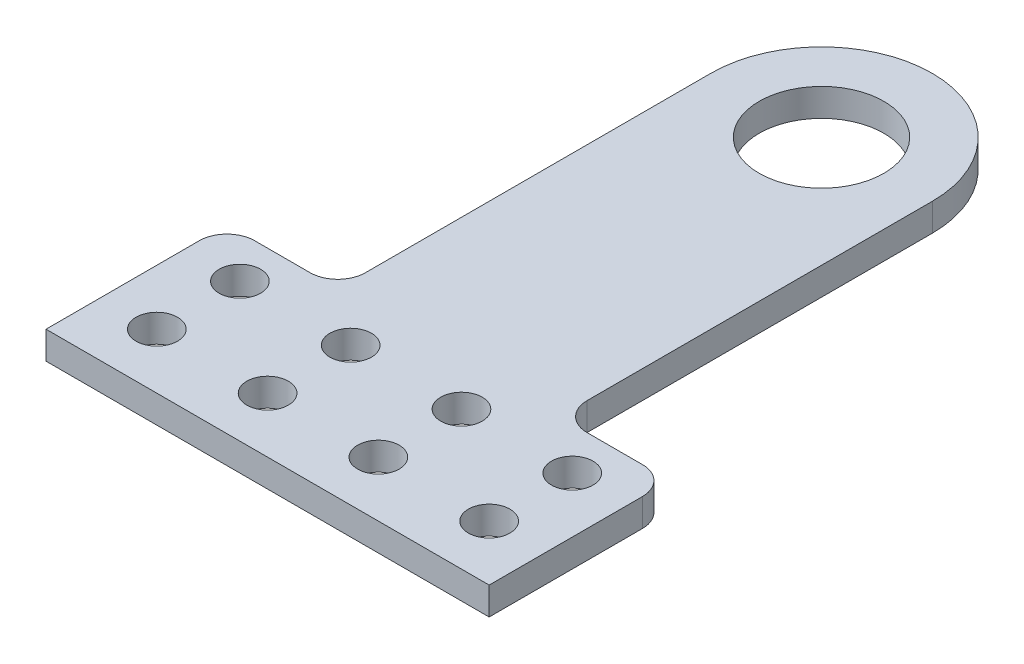
ISO-10303-21;
HEADER;
FILE_DESCRIPTION(('STEP AP214'),'2;1');
FILE_NAME('part.step','',(''),(''),'','','');
FILE_SCHEMA(('AUTOMOTIVE_DESIGN { 1 0 10303 214 1 1 1 1 }'));
ENDSEC;
DATA;
#1=APPLICATION_CONTEXT('core data for automotive mechanical design processes');
#2=APPLICATION_PROTOCOL_DEFINITION('international standard','automotive_design',2000,#1);
#3=PRODUCT_CONTEXT('',#1,'mechanical');
#4=PRODUCT('Part','Part','',(#3));
#5=PRODUCT_RELATED_PRODUCT_CATEGORY('part','',(#4));
#6=PRODUCT_DEFINITION_FORMATION('','',#4);
#7=PRODUCT_DEFINITION_CONTEXT('part definition',#1,'design');
#8=PRODUCT_DEFINITION('design','',#6,#7);
#9=PRODUCT_DEFINITION_SHAPE('','',#8);
#10=(LENGTH_UNIT() NAMED_UNIT(*) SI_UNIT(.MILLI.,.METRE.));
#11=(NAMED_UNIT(*) PLANE_ANGLE_UNIT() SI_UNIT($,.RADIAN.));
#12=(NAMED_UNIT(*) SI_UNIT($,.STERADIAN.) SOLID_ANGLE_UNIT());
#13=UNCERTAINTY_MEASURE_WITH_UNIT(LENGTH_MEASURE(1.E-05),#10,'distance_accuracy_value','');
#14=(GEOMETRIC_REPRESENTATION_CONTEXT(3) GLOBAL_UNCERTAINTY_ASSIGNED_CONTEXT((#13)) GLOBAL_UNIT_ASSIGNED_CONTEXT((#10,
#11,#12)) REPRESENTATION_CONTEXT('',''));
#15=CARTESIAN_POINT('',(0.,0.,0.));
#16=DIRECTION('',(0.,0.,1.));
#17=DIRECTION('',(1.,0.,0.));
#18=AXIS2_PLACEMENT_3D('',#15,#16,#17);
#19=CARTESIAN_POINT('',(38.1,0.,44.45));
#20=DIRECTION('',(0.,1.,0.));
#21=DIRECTION('',(0.,0.,1.));
#22=AXIS2_PLACEMENT_3D('',#19,#20,#21);
#23=CYLINDRICAL_SURFACE('',#22,4.7625);
#24=CARTESIAN_POINT('',(38.1,0.,44.45));
#25=DIRECTION('',(0.,1.,0.));
#26=DIRECTION('',(0.,0.,1.));
#27=AXIS2_PLACEMENT_3D('',#24,#25,#26);
#28=CIRCLE('',#27,4.7625);
#29=CARTESIAN_POINT('',(38.1,0.,49.2125));
#30=VERTEX_POINT('',#29);
#31=EDGE_CURVE('E219',#30,#30,#28,.T.);
#32=ORIENTED_EDGE('',*,*,#31,.F.);
#33=EDGE_LOOP('',(#32));
#34=FACE_BOUND('',#33,.T.);
#35=CARTESIAN_POINT('',(38.1,6.35,44.45));
#36=DIRECTION('',(0.,1.,0.));
#37=DIRECTION('',(0.,0.,1.));
#38=AXIS2_PLACEMENT_3D('',#35,#36,#37);
#39=CIRCLE('',#38,4.7625);
#40=CARTESIAN_POINT('',(38.1,6.35,49.2125));
#41=VERTEX_POINT('',#40);
#42=EDGE_CURVE('E222',#41,#41,#39,.T.);
#43=ORIENTED_EDGE('',*,*,#42,.T.);
#44=EDGE_LOOP('',(#43));
#45=FACE_BOUND('',#44,.T.);
#46=ADVANCED_FACE('F37',(#34,#45),#23,.F.);
#47=CARTESIAN_POINT('',(12.7,0.,44.45));
#48=DIRECTION('',(0.,1.,0.));
#49=DIRECTION('',(0.,0.,1.));
#50=AXIS2_PLACEMENT_3D('',#47,#48,#49);
#51=CYLINDRICAL_SURFACE('',#50,4.7625);
#52=CARTESIAN_POINT('',(12.7,0.,44.45));
#53=DIRECTION('',(0.,1.,0.));
#54=DIRECTION('',(0.,0.,1.));
#55=AXIS2_PLACEMENT_3D('',#52,#53,#54);
#56=CIRCLE('',#55,4.7625);
#57=CARTESIAN_POINT('',(12.7,0.,49.2125));
#58=VERTEX_POINT('',#57);
#59=EDGE_CURVE('E213',#58,#58,#56,.T.);
#60=ORIENTED_EDGE('',*,*,#59,.F.);
#61=EDGE_LOOP('',(#60));
#62=FACE_BOUND('',#61,.T.);
#63=CARTESIAN_POINT('',(12.7,6.35,44.45));
#64=DIRECTION('',(0.,1.,0.));
#65=DIRECTION('',(0.,0.,1.));
#66=AXIS2_PLACEMENT_3D('',#63,#64,#65);
#67=CIRCLE('',#66,4.7625);
#68=CARTESIAN_POINT('',(12.7,6.35,49.2125));
#69=VERTEX_POINT('',#68);
#70=EDGE_CURVE('E216',#69,#69,#67,.T.);
#71=ORIENTED_EDGE('',*,*,#70,.T.);
#72=EDGE_LOOP('',(#71));
#73=FACE_BOUND('',#72,.T.);
#74=ADVANCED_FACE('F327',(#62,#73),#51,.F.);
#75=CARTESIAN_POINT('',(-12.7,0.,44.45));
#76=DIRECTION('',(0.,1.,0.));
#77=DIRECTION('',(0.,0.,1.));
#78=AXIS2_PLACEMENT_3D('',#75,#76,#77);
#79=CYLINDRICAL_SURFACE('',#78,4.7625);
#80=CARTESIAN_POINT('',(-12.7,0.,44.45));
#81=DIRECTION('',(0.,1.,0.));
#82=DIRECTION('',(0.,0.,1.));
#83=AXIS2_PLACEMENT_3D('',#80,#81,#82);
#84=CIRCLE('',#83,4.7625);
#85=CARTESIAN_POINT('',(-12.7,0.,49.2125));
#86=VERTEX_POINT('',#85);
#87=EDGE_CURVE('E207',#86,#86,#84,.T.);
#88=ORIENTED_EDGE('',*,*,#87,.F.);
#89=EDGE_LOOP('',(#88));
#90=FACE_BOUND('',#89,.T.);
#91=CARTESIAN_POINT('',(-12.7,6.35,44.45));
#92=DIRECTION('',(0.,1.,0.));
#93=DIRECTION('',(0.,0.,1.));
#94=AXIS2_PLACEMENT_3D('',#91,#92,#93);
#95=CIRCLE('',#94,4.7625);
#96=CARTESIAN_POINT('',(-12.7,6.35,49.2125));
#97=VERTEX_POINT('',#96);
#98=EDGE_CURVE('E210',#97,#97,#95,.T.);
#99=ORIENTED_EDGE('',*,*,#98,.T.);
#100=EDGE_LOOP('',(#99));
#101=FACE_BOUND('',#100,.T.);
#102=ADVANCED_FACE('F333',(#90,#101),#79,.F.);
#103=CARTESIAN_POINT('',(-38.1,0.,44.45));
#104=DIRECTION('',(0.,1.,0.));
#105=DIRECTION('',(0.,0.,1.));
#106=AXIS2_PLACEMENT_3D('',#103,#104,#105);
#107=CYLINDRICAL_SURFACE('',#106,4.7625);
#108=CARTESIAN_POINT('',(-38.1,0.,44.45));
#109=DIRECTION('',(0.,1.,0.));
#110=DIRECTION('',(0.,0.,1.));
#111=AXIS2_PLACEMENT_3D('',#108,#109,#110);
#112=CIRCLE('',#111,4.7625);
#113=CARTESIAN_POINT('',(-38.1,0.,49.2125));
#114=VERTEX_POINT('',#113);
#115=EDGE_CURVE('E201',#114,#114,#112,.T.);
#116=ORIENTED_EDGE('',*,*,#115,.F.);
#117=EDGE_LOOP('',(#116));
#118=FACE_BOUND('',#117,.T.);
#119=CARTESIAN_POINT('',(-38.1,6.35,44.45));
#120=DIRECTION('',(0.,1.,0.));
#121=DIRECTION('',(0.,0.,1.));
#122=AXIS2_PLACEMENT_3D('',#119,#120,#121);
#123=CIRCLE('',#122,4.7625);
#124=CARTESIAN_POINT('',(-38.1,6.35,49.2125));
#125=VERTEX_POINT('',#124);
#126=EDGE_CURVE('E204',#125,#125,#123,.T.);
#127=ORIENTED_EDGE('',*,*,#126,.T.);
#128=EDGE_LOOP('',(#127));
#129=FACE_BOUND('',#128,.T.);
#130=ADVANCED_FACE('F398',(#118,#129),#107,.F.);
#131=CARTESIAN_POINT('',(38.1,0.,63.5));
#132=DIRECTION('',(0.,1.,0.));
#133=DIRECTION('',(0.,0.,1.));
#134=AXIS2_PLACEMENT_3D('',#131,#132,#133);
#135=CYLINDRICAL_SURFACE('',#134,4.7625);
#136=CARTESIAN_POINT('',(38.1,0.,63.5));
#137=DIRECTION('',(0.,1.,0.));
#138=DIRECTION('',(0.,0.,1.));
#139=AXIS2_PLACEMENT_3D('',#136,#137,#138);
#140=CIRCLE('',#139,4.7625);
#141=CARTESIAN_POINT('',(38.1,0.,68.2625));
#142=VERTEX_POINT('',#141);
#143=EDGE_CURVE('E195',#142,#142,#140,.T.);
#144=ORIENTED_EDGE('',*,*,#143,.F.);
#145=EDGE_LOOP('',(#144));
#146=FACE_BOUND('',#145,.T.);
#147=CARTESIAN_POINT('',(38.1,6.35,63.5));
#148=DIRECTION('',(0.,1.,0.));
#149=DIRECTION('',(0.,0.,1.));
#150=AXIS2_PLACEMENT_3D('',#147,#148,#149);
#151=CIRCLE('',#150,4.7625);
#152=CARTESIAN_POINT('',(38.1,6.35,68.2625));
#153=VERTEX_POINT('',#152);
#154=EDGE_CURVE('E198',#153,#153,#151,.T.);
#155=ORIENTED_EDGE('',*,*,#154,.T.);
#156=EDGE_LOOP('',(#155));
#157=FACE_BOUND('',#156,.T.);
#158=ADVANCED_FACE('F394',(#146,#157),#135,.F.);
#159=CARTESIAN_POINT('',(12.7,0.,63.5));
#160=DIRECTION('',(0.,1.,0.));
#161=DIRECTION('',(0.,0.,1.));
#162=AXIS2_PLACEMENT_3D('',#159,#160,#161);
#163=CYLINDRICAL_SURFACE('',#162,4.7625);
#164=CARTESIAN_POINT('',(12.7,0.,63.5));
#165=DIRECTION('',(0.,1.,0.));
#166=DIRECTION('',(0.,0.,1.));
#167=AXIS2_PLACEMENT_3D('',#164,#165,#166);
#168=CIRCLE('',#167,4.7625);
#169=CARTESIAN_POINT('',(12.7,0.,68.2625));
#170=VERTEX_POINT('',#169);
#171=EDGE_CURVE('E142',#170,#170,#168,.T.);
#172=ORIENTED_EDGE('',*,*,#171,.F.);
#173=EDGE_LOOP('',(#172));
#174=FACE_BOUND('',#173,.T.);
#175=CARTESIAN_POINT('',(12.7,6.35,63.5));
#176=DIRECTION('',(0.,1.,0.));
#177=DIRECTION('',(0.,0.,1.));
#178=AXIS2_PLACEMENT_3D('',#175,#176,#177);
#179=CIRCLE('',#178,4.7625);
#180=CARTESIAN_POINT('',(12.7,6.35,68.2625));
#181=VERTEX_POINT('',#180);
#182=EDGE_CURVE('E192',#181,#181,#179,.T.);
#183=ORIENTED_EDGE('',*,*,#182,.T.);
#184=EDGE_LOOP('',(#183));
#185=FACE_BOUND('',#184,.T.);
#186=ADVANCED_FACE('F391',(#174,#185),#163,.F.);
#187=CARTESIAN_POINT('',(-50.8,6.35,0.));
#188=DIRECTION('',(-1.,0.,0.));
#189=DIRECTION('',(0.,0.,1.));
#190=AXIS2_PLACEMENT_3D('',#187,#188,#189);
#191=PLANE('',#190);
#192=DIRECTION('',(0.,0.,-1.));
#193=VECTOR('',#192,1.);
#194=CARTESIAN_POINT('',(-50.8,6.35,0.));
#195=LINE('',#194,#193);
#196=CARTESIAN_POINT('',(-50.8,6.35,76.2));
#197=VERTEX_POINT('',#196);
#198=CARTESIAN_POINT('',(-50.8,6.35,41.0565870391901));
#199=VERTEX_POINT('',#198);
#200=EDGE_CURVE('E134',#197,#199,#195,.T.);
#201=ORIENTED_EDGE('',*,*,#200,.T.);
#202=DIRECTION('',(0.,-1.,0.));
#203=VECTOR('',#202,1.);
#204=CARTESIAN_POINT('',(-50.8,0.,41.0565870391901));
#205=LINE('',#204,#203);
#206=CARTESIAN_POINT('',(-50.8,0.,41.0565870391901));
#207=VERTEX_POINT('',#206);
#208=EDGE_CURVE('E242',#199,#207,#205,.T.);
#209=ORIENTED_EDGE('',*,*,#208,.T.);
#210=DIRECTION('',(0.,0.,-1.));
#211=VECTOR('',#210,1.);
#212=CARTESIAN_POINT('',(-50.8,0.,0.));
#213=LINE('',#212,#211);
#214=CARTESIAN_POINT('',(-50.8,0.,76.2));
#215=VERTEX_POINT('',#214);
#216=EDGE_CURVE('E137',#215,#207,#213,.T.);
#217=ORIENTED_EDGE('',*,*,#216,.F.);
#218=DIRECTION('',(0.,-1.,0.));
#219=VECTOR('',#218,1.);
#220=CARTESIAN_POINT('',(-50.8,6.35,76.2));
#221=LINE('',#220,#219);
#222=EDGE_CURVE('E130',#197,#215,#221,.T.);
#223=ORIENTED_EDGE('',*,*,#222,.F.);
#224=EDGE_LOOP('',(#201,#209,#217,#223));
#225=FACE_BOUND('',#224,.T.);
#226=ADVANCED_FACE('F132',(#225),#191,.T.);
#227=CARTESIAN_POINT('',(0.,6.35,76.2));
#228=DIRECTION('',(0.,0.,1.));
#229=DIRECTION('',(1.,0.,0.));
#230=AXIS2_PLACEMENT_3D('',#227,#228,#229);
#231=PLANE('',#230);
#232=DIRECTION('',(-1.,0.,0.));
#233=VECTOR('',#232,1.);
#234=CARTESIAN_POINT('',(0.,0.,76.2));
#235=LINE('',#234,#233);
#236=CARTESIAN_POINT('',(50.8,0.,76.2));
#237=VERTEX_POINT('',#236);
#238=EDGE_CURVE('E172',#237,#215,#235,.T.);
#239=ORIENTED_EDGE('',*,*,#238,.F.);
#240=DIRECTION('',(0.,-1.,0.));
#241=VECTOR('',#240,1.);
#242=CARTESIAN_POINT('',(50.8,6.35,76.2));
#243=LINE('',#242,#241);
#244=CARTESIAN_POINT('',(50.8,6.35,76.2));
#245=VERTEX_POINT('',#244);
#246=EDGE_CURVE('E143',#245,#237,#243,.T.);
#247=ORIENTED_EDGE('',*,*,#246,.F.);
#248=DIRECTION('',(-1.,0.,0.));
#249=VECTOR('',#248,1.);
#250=CARTESIAN_POINT('',(0.,6.35,76.2));
#251=LINE('',#250,#249);
#252=EDGE_CURVE('E149',#245,#197,#251,.T.);
#253=ORIENTED_EDGE('',*,*,#252,.T.);
#254=ORIENTED_EDGE('',*,*,#222,.T.);
#255=EDGE_LOOP('',(#239,#247,#253,#254));
#256=FACE_BOUND('',#255,.T.);
#257=ADVANCED_FACE('F155',(#256),#231,.T.);
#258=CARTESIAN_POINT('',(50.8,6.35,0.));
#259=DIRECTION('',(-1.,0.,0.));
#260=DIRECTION('',(0.,0.,1.));
#261=AXIS2_PLACEMENT_3D('',#258,#259,#260);
#262=PLANE('',#261);
#263=DIRECTION('',(0.,0.,-1.));
#264=VECTOR('',#263,1.);
#265=CARTESIAN_POINT('',(50.8,0.,0.));
#266=LINE('',#265,#264);
#267=CARTESIAN_POINT('',(50.8,0.,41.05658703919));
#268=VERTEX_POINT('',#267);
#269=EDGE_CURVE('E175',#237,#268,#266,.T.);
#270=ORIENTED_EDGE('',*,*,#269,.T.);
#271=DIRECTION('',(0.,-1.,0.));
#272=VECTOR('',#271,1.);
#273=CARTESIAN_POINT('',(50.8,6.35,41.05658703919));
#274=LINE('',#273,#272);
#275=CARTESIAN_POINT('',(50.8,6.35,41.05658703919));
#276=VERTEX_POINT('',#275);
#277=EDGE_CURVE('E234',#268,#276,#274,.F.);
#278=ORIENTED_EDGE('',*,*,#277,.T.);
#279=DIRECTION('',(0.,0.,-1.));
#280=VECTOR('',#279,1.);
#281=CARTESIAN_POINT('',(50.8,6.35,0.));
#282=LINE('',#281,#280);
#283=EDGE_CURVE('E157',#245,#276,#282,.T.);
#284=ORIENTED_EDGE('',*,*,#283,.F.);
#285=ORIENTED_EDGE('',*,*,#246,.T.);
#286=EDGE_LOOP('',(#270,#278,#284,#285));
#287=FACE_BOUND('',#286,.T.);
#288=ADVANCED_FACE('F372',(#287),#262,.F.);
#289=CARTESIAN_POINT('',(0.,6.35,34.70658703919));
#290=DIRECTION('',(0.,0.,1.));
#291=DIRECTION('',(1.,0.,0.));
#292=AXIS2_PLACEMENT_3D('',#289,#290,#291);
#293=PLANE('',#292);
#294=DIRECTION('',(-1.,0.,0.));
#295=VECTOR('',#294,1.);
#296=CARTESIAN_POINT('',(0.,6.35,34.70658703919));
#297=LINE('',#296,#295);
#298=CARTESIAN_POINT('',(44.45,6.35,34.70658703919));
#299=VERTEX_POINT('',#298);
#300=CARTESIAN_POINT('',(31.75,6.35,34.70658703919));
#301=VERTEX_POINT('',#300);
#302=EDGE_CURVE('E159',#299,#301,#297,.T.);
#303=ORIENTED_EDGE('',*,*,#302,.F.);
#304=DIRECTION('',(0.,-1.,0.));
#305=VECTOR('',#304,1.);
#306=CARTESIAN_POINT('',(44.45,6.35,34.70658703919));
#307=LINE('',#306,#305);
#308=CARTESIAN_POINT('',(44.45,0.,34.70658703919));
#309=VERTEX_POINT('',#308);
#310=EDGE_CURVE('E227',#299,#309,#307,.T.);
#311=ORIENTED_EDGE('',*,*,#310,.T.);
#312=DIRECTION('',(-1.,0.,0.));
#313=VECTOR('',#312,1.);
#314=CARTESIAN_POINT('',(0.,0.,34.70658703919));
#315=LINE('',#314,#313);
#316=CARTESIAN_POINT('',(31.75,0.,34.70658703919));
#317=VERTEX_POINT('',#316);
#318=EDGE_CURVE('E178',#309,#317,#315,.T.);
#319=ORIENTED_EDGE('',*,*,#318,.T.);
#320=DIRECTION('',(0.,-1.,0.));
#321=VECTOR('',#320,1.);
#322=CARTESIAN_POINT('',(31.75,6.35,34.70658703919));
#323=LINE('',#322,#321);
#324=EDGE_CURVE('E225',#317,#301,#323,.F.);
#325=ORIENTED_EDGE('',*,*,#324,.T.);
#326=EDGE_LOOP('',(#303,#311,#319,#325));
#327=FACE_BOUND('',#326,.T.);
#328=ADVANCED_FACE('F376',(#327),#293,.F.);
#329=CARTESIAN_POINT('',(25.4,6.35,0.));
#330=DIRECTION('',(-1.,0.,0.));
#331=DIRECTION('',(0.,0.,1.));
#332=AXIS2_PLACEMENT_3D('',#329,#330,#331);
#333=PLANE('',#332);
#334=DIRECTION('',(0.,0.,-1.));
#335=VECTOR('',#334,1.);
#336=CARTESIAN_POINT('',(25.4,0.,0.));
#337=LINE('',#336,#335);
#338=CARTESIAN_POINT('',(25.4,0.,28.35658703919));
#339=VERTEX_POINT('',#338);
#340=CARTESIAN_POINT('',(25.4,0.,-50.8));
#341=VERTEX_POINT('',#340);
#342=EDGE_CURVE('E181',#339,#341,#337,.T.);
#343=ORIENTED_EDGE('',*,*,#342,.T.);
#344=DIRECTION('',(0.,-1.,0.));
#345=VECTOR('',#344,1.);
#346=CARTESIAN_POINT('',(25.4,6.35,-50.8));
#347=LINE('',#346,#345);
#348=CARTESIAN_POINT('',(25.4,6.35,-50.8));
#349=VERTEX_POINT('',#348);
#350=EDGE_CURVE('E263',#341,#349,#347,.F.);
#351=ORIENTED_EDGE('',*,*,#350,.T.);
#352=DIRECTION('',(0.,0.,-1.));
#353=VECTOR('',#352,1.);
#354=CARTESIAN_POINT('',(25.4,6.35,0.));
#355=LINE('',#354,#353);
#356=CARTESIAN_POINT('',(25.4,6.35,28.35658703919));
#357=VERTEX_POINT('',#356);
#358=EDGE_CURVE('E165',#357,#349,#355,.T.);
#359=ORIENTED_EDGE('',*,*,#358,.F.);
#360=DIRECTION('',(0.,-1.,0.));
#361=VECTOR('',#360,1.);
#362=CARTESIAN_POINT('',(25.4,0.,28.35658703919));
#363=LINE('',#362,#361);
#364=EDGE_CURVE('E239',#357,#339,#363,.T.);
#365=ORIENTED_EDGE('',*,*,#364,.T.);
#366=EDGE_LOOP('',(#343,#351,#359,#365));
#367=FACE_BOUND('',#366,.T.);
#368=ADVANCED_FACE('F270',(#367),#333,.F.);
#369=CARTESIAN_POINT('',(-25.4,6.35,0.));
#370=DIRECTION('',(-1.,0.,0.));
#371=DIRECTION('',(0.,0.,1.));
#372=AXIS2_PLACEMENT_3D('',#369,#370,#371);
#373=PLANE('',#372);
#374=DIRECTION('',(0.,0.,-1.));
#375=VECTOR('',#374,1.);
#376=CARTESIAN_POINT('',(-25.4,6.35,0.));
#377=LINE('',#376,#375);
#378=CARTESIAN_POINT('',(-25.4,6.35,28.35658703919));
#379=VERTEX_POINT('',#378);
#380=CARTESIAN_POINT('',(-25.4,6.35,-50.8));
#381=VERTEX_POINT('',#380);
#382=EDGE_CURVE('E167',#379,#381,#377,.T.);
#383=ORIENTED_EDGE('',*,*,#382,.T.);
#384=DIRECTION('',(0.,-1.,0.));
#385=VECTOR('',#384,1.);
#386=CARTESIAN_POINT('',(-25.4,6.35,-50.8));
#387=LINE('',#386,#385);
#388=CARTESIAN_POINT('',(-25.4,0.,-50.8));
#389=VERTEX_POINT('',#388);
#390=EDGE_CURVE('E11',#381,#389,#387,.T.);
#391=ORIENTED_EDGE('',*,*,#390,.T.);
#392=DIRECTION('',(0.,0.,-1.));
#393=VECTOR('',#392,1.);
#394=CARTESIAN_POINT('',(-25.4,0.,0.));
#395=LINE('',#394,#393);
#396=CARTESIAN_POINT('',(-25.4,0.,28.35658703919));
#397=VERTEX_POINT('',#396);
#398=EDGE_CURVE('E184',#397,#389,#395,.T.);
#399=ORIENTED_EDGE('',*,*,#398,.F.);
#400=DIRECTION('',(0.,-1.,0.));
#401=VECTOR('',#400,1.);
#402=CARTESIAN_POINT('',(-25.4,6.35,28.35658703919));
#403=LINE('',#402,#401);
#404=EDGE_CURVE('E249',#397,#379,#403,.F.);
#405=ORIENTED_EDGE('',*,*,#404,.T.);
#406=EDGE_LOOP('',(#383,#391,#399,#405));
#407=FACE_BOUND('',#406,.T.);
#408=ADVANCED_FACE('F320',(#407),#373,.T.);
#409=CARTESIAN_POINT('',(0.,6.35,34.70658703919));
#410=DIRECTION('',(0.,0.,1.));
#411=DIRECTION('',(1.,0.,0.));
#412=AXIS2_PLACEMENT_3D('',#409,#410,#411);
#413=PLANE('',#412);
#414=DIRECTION('',(-1.,0.,0.));
#415=VECTOR('',#414,1.);
#416=CARTESIAN_POINT('',(0.,0.,34.70658703919));
#417=LINE('',#416,#415);
#418=CARTESIAN_POINT('',(-31.75,0.,34.7065870391901));
#419=VERTEX_POINT('',#418);
#420=CARTESIAN_POINT('',(-44.45,0.,34.7065870391901));
#421=VERTEX_POINT('',#420);
#422=EDGE_CURVE('E153',#419,#421,#417,.T.);
#423=ORIENTED_EDGE('',*,*,#422,.T.);
#424=DIRECTION('',(0.,-1.,0.));
#425=VECTOR('',#424,1.);
#426=CARTESIAN_POINT('',(-44.45,6.35,34.7065870391901));
#427=LINE('',#426,#425);
#428=CARTESIAN_POINT('',(-44.45,6.35,34.7065870391901));
#429=VERTEX_POINT('',#428);
#430=EDGE_CURVE('E247',#421,#429,#427,.F.);
#431=ORIENTED_EDGE('',*,*,#430,.T.);
#432=DIRECTION('',(-1.,0.,0.));
#433=VECTOR('',#432,1.);
#434=CARTESIAN_POINT('',(0.,6.35,34.70658703919));
#435=LINE('',#434,#433);
#436=CARTESIAN_POINT('',(-31.75,6.35,34.7065870391901));
#437=VERTEX_POINT('',#436);
#438=EDGE_CURVE('E169',#437,#429,#435,.T.);
#439=ORIENTED_EDGE('',*,*,#438,.F.);
#440=DIRECTION('',(0.,-1.,0.));
#441=VECTOR('',#440,1.);
#442=CARTESIAN_POINT('',(-31.75,6.35,34.7065870391901));
#443=LINE('',#442,#441);
#444=EDGE_CURVE('E244',#437,#419,#443,.T.);
#445=ORIENTED_EDGE('',*,*,#444,.T.);
#446=EDGE_LOOP('',(#423,#431,#439,#445));
#447=FACE_BOUND('',#446,.T.);
#448=ADVANCED_FACE('F312',(#447),#413,.F.);
#449=CARTESIAN_POINT('',(0.,6.35,0.));
#450=DIRECTION('',(0.,1.,0.));
#451=DIRECTION('',(0.,0.,1.));
#452=AXIS2_PLACEMENT_3D('',#449,#450,#451);
#453=PLANE('',#452);
#454=CARTESIAN_POINT('',(-12.7,6.35,63.5));
#455=DIRECTION('',(0.,1.,0.));
#456=DIRECTION('',(0.,0.,1.));
#457=AXIS2_PLACEMENT_3D('',#454,#455,#456);
#458=CIRCLE('',#457,4.7625);
#459=CARTESIAN_POINT('',(-12.7,6.35,68.2625));
#460=VERTEX_POINT('',#459);
#461=EDGE_CURVE('E291',#460,#460,#458,.T.);
#462=ORIENTED_EDGE('',*,*,#461,.F.);
#463=EDGE_LOOP('',(#462));
#464=FACE_BOUND('',#463,.T.);
#465=CARTESIAN_POINT('',(-38.1,6.35,63.5));
#466=DIRECTION('',(0.,1.,0.));
#467=DIRECTION('',(0.,0.,1.));
#468=AXIS2_PLACEMENT_3D('',#465,#466,#467);
#469=CIRCLE('',#468,4.7625);
#470=CARTESIAN_POINT('',(-38.1,6.35,68.2625));
#471=VERTEX_POINT('',#470);
#472=EDGE_CURVE('E296',#471,#471,#469,.T.);
#473=ORIENTED_EDGE('',*,*,#472,.F.);
#474=EDGE_LOOP('',(#473));
#475=FACE_BOUND('',#474,.T.);
#476=CARTESIAN_POINT('',(0.,6.35,-50.8));
#477=DIRECTION('',(0.,1.,0.));
#478=DIRECTION('',(0.,0.,1.));
#479=AXIS2_PLACEMENT_3D('',#476,#477,#478);
#480=CIRCLE('',#479,14.3002);
#481=CARTESIAN_POINT('',(0.,6.35,-36.4998));
#482=VERTEX_POINT('',#481);
#483=EDGE_CURVE('E302',#482,#482,#480,.T.);
#484=ORIENTED_EDGE('',*,*,#483,.F.);
#485=EDGE_LOOP('',(#484));
#486=FACE_BOUND('',#485,.T.);
#487=ORIENTED_EDGE('',*,*,#358,.T.);
#488=CARTESIAN_POINT('',(0.,6.35,-50.8));
#489=DIRECTION('',(0.,1.,0.));
#490=DIRECTION('',(0.,0.,1.));
#491=AXIS2_PLACEMENT_3D('',#488,#489,#490);
#492=CIRCLE('',#491,25.4);
#493=CARTESIAN_POINT('',(0.,6.35,-76.2));
#494=VERTEX_POINT('',#493);
#495=EDGE_CURVE('E46',#349,#494,#492,.T.);
#496=ORIENTED_EDGE('',*,*,#495,.T.);
#497=CARTESIAN_POINT('',(0.,6.35,-50.8));
#498=DIRECTION('',(0.,1.,0.));
#499=DIRECTION('',(0.,0.,1.));
#500=AXIS2_PLACEMENT_3D('',#497,#498,#499);
#501=CIRCLE('',#500,25.4);
#502=EDGE_CURVE('E53',#494,#381,#501,.T.);
#503=ORIENTED_EDGE('',*,*,#502,.T.);
#504=ORIENTED_EDGE('',*,*,#382,.F.);
#505=CARTESIAN_POINT('',(-31.75,6.35,28.35658703919));
#506=DIRECTION('',(0.,1.,0.));
#507=DIRECTION('',(0.,0.,1.));
#508=AXIS2_PLACEMENT_3D('',#505,#506,#507);
#509=CIRCLE('',#508,6.35);
#510=EDGE_CURVE('E257',#379,#437,#509,.F.);
#511=ORIENTED_EDGE('',*,*,#510,.T.);
#512=ORIENTED_EDGE('',*,*,#438,.T.);
#513=CARTESIAN_POINT('',(-44.45,6.35,41.0565870391901));
#514=DIRECTION('',(0.,1.,0.));
#515=DIRECTION('',(0.,0.,1.));
#516=AXIS2_PLACEMENT_3D('',#513,#514,#515);
#517=CIRCLE('',#516,6.35);
#518=EDGE_CURVE('E152',#429,#199,#517,.T.);
#519=ORIENTED_EDGE('',*,*,#518,.T.);
#520=ORIENTED_EDGE('',*,*,#200,.F.);
#521=ORIENTED_EDGE('',*,*,#252,.F.);
#522=ORIENTED_EDGE('',*,*,#283,.T.);
#523=CARTESIAN_POINT('',(44.45,6.35,41.05658703919));
#524=DIRECTION('',(0.,1.,0.));
#525=DIRECTION('',(0.,0.,1.));
#526=AXIS2_PLACEMENT_3D('',#523,#524,#525);
#527=CIRCLE('',#526,6.35);
#528=EDGE_CURVE('E237',#276,#299,#527,.T.);
#529=ORIENTED_EDGE('',*,*,#528,.T.);
#530=ORIENTED_EDGE('',*,*,#302,.T.);
#531=CARTESIAN_POINT('',(31.75,6.35,28.35658703919));
#532=DIRECTION('',(0.,1.,0.));
#533=DIRECTION('',(0.,0.,1.));
#534=AXIS2_PLACEMENT_3D('',#531,#532,#533);
#535=CIRCLE('',#534,6.35);
#536=EDGE_CURVE('E253',#301,#357,#535,.F.);
#537=ORIENTED_EDGE('',*,*,#536,.T.);
#538=EDGE_LOOP('',(#487,#496,#503,#504,#511,#512,#519,#520,#521,#522,#529,#530,#537));
#539=FACE_BOUND('',#538,.T.);
#540=ORIENTED_EDGE('',*,*,#182,.F.);
#541=EDGE_LOOP('',(#540));
#542=FACE_BOUND('',#541,.T.);
#543=ORIENTED_EDGE('',*,*,#154,.F.);
#544=EDGE_LOOP('',(#543));
#545=FACE_BOUND('',#544,.T.);
#546=ORIENTED_EDGE('',*,*,#126,.F.);
#547=EDGE_LOOP('',(#546));
#548=FACE_BOUND('',#547,.T.);
#549=ORIENTED_EDGE('',*,*,#98,.F.);
#550=EDGE_LOOP('',(#549));
#551=FACE_BOUND('',#550,.T.);
#552=ORIENTED_EDGE('',*,*,#70,.F.);
#553=EDGE_LOOP('',(#552));
#554=FACE_BOUND('',#553,.T.);
#555=ORIENTED_EDGE('',*,*,#42,.F.);
#556=EDGE_LOOP('',(#555));
#557=FACE_BOUND('',#556,.T.);
#558=ADVANCED_FACE('F146',(#464,#475,#486,#539,#542,#545,#548,#551,#554,#557),#453,.T.);
#559=CARTESIAN_POINT('',(0.,0.,0.));
#560=DIRECTION('',(0.,1.,0.));
#561=DIRECTION('',(0.,0.,1.));
#562=AXIS2_PLACEMENT_3D('',#559,#560,#561);
#563=PLANE('',#562);
#564=CARTESIAN_POINT('',(-12.7,0.,63.5));
#565=DIRECTION('',(0.,1.,0.));
#566=DIRECTION('',(0.,0.,1.));
#567=AXIS2_PLACEMENT_3D('',#564,#565,#566);
#568=CIRCLE('',#567,4.7625);
#569=CARTESIAN_POINT('',(-12.7,0.,68.2625));
#570=VERTEX_POINT('',#569);
#571=EDGE_CURVE('E289',#570,#570,#568,.T.);
#572=ORIENTED_EDGE('',*,*,#571,.T.);
#573=EDGE_LOOP('',(#572));
#574=FACE_BOUND('',#573,.T.);
#575=CARTESIAN_POINT('',(-38.1,0.,63.5));
#576=DIRECTION('',(0.,1.,0.));
#577=DIRECTION('',(0.,0.,1.));
#578=AXIS2_PLACEMENT_3D('',#575,#576,#577);
#579=CIRCLE('',#578,4.7625);
#580=CARTESIAN_POINT('',(-38.1,0.,68.2625));
#581=VERTEX_POINT('',#580);
#582=EDGE_CURVE('E299',#581,#581,#579,.T.);
#583=ORIENTED_EDGE('',*,*,#582,.T.);
#584=EDGE_LOOP('',(#583));
#585=FACE_BOUND('',#584,.T.);
#586=CARTESIAN_POINT('',(0.,0.,-50.8));
#587=DIRECTION('',(0.,1.,0.));
#588=DIRECTION('',(0.,0.,1.));
#589=AXIS2_PLACEMENT_3D('',#586,#587,#588);
#590=CIRCLE('',#589,14.3002);
#591=CARTESIAN_POINT('',(0.,0.,-36.4998));
#592=VERTEX_POINT('',#591);
#593=EDGE_CURVE('E173',#592,#592,#590,.T.);
#594=ORIENTED_EDGE('',*,*,#593,.T.);
#595=EDGE_LOOP('',(#594));
#596=FACE_BOUND('',#595,.T.);
#597=CARTESIAN_POINT('',(0.,0.,-50.8));
#598=DIRECTION('',(0.,1.,0.));
#599=DIRECTION('',(0.,0.,1.));
#600=AXIS2_PLACEMENT_3D('',#597,#598,#599);
#601=CIRCLE('',#600,25.4);
#602=CARTESIAN_POINT('',(0.,0.,-76.2));
#603=VERTEX_POINT('',#602);
#604=EDGE_CURVE('E259',#389,#603,#601,.F.);
#605=ORIENTED_EDGE('',*,*,#604,.T.);
#606=CARTESIAN_POINT('',(0.,0.,-50.8));
#607=DIRECTION('',(0.,1.,0.));
#608=DIRECTION('',(0.,0.,1.));
#609=AXIS2_PLACEMENT_3D('',#606,#607,#608);
#610=CIRCLE('',#609,25.4);
#611=EDGE_CURVE('E261',#603,#341,#610,.F.);
#612=ORIENTED_EDGE('',*,*,#611,.T.);
#613=ORIENTED_EDGE('',*,*,#342,.F.);
#614=CARTESIAN_POINT('',(31.75,0.,28.35658703919));
#615=DIRECTION('',(0.,1.,0.));
#616=DIRECTION('',(0.,0.,1.));
#617=AXIS2_PLACEMENT_3D('',#614,#615,#616);
#618=CIRCLE('',#617,6.35);
#619=EDGE_CURVE('E251',#339,#317,#618,.T.);
#620=ORIENTED_EDGE('',*,*,#619,.T.);
#621=ORIENTED_EDGE('',*,*,#318,.F.);
#622=CARTESIAN_POINT('',(44.45,0.,41.05658703919));
#623=DIRECTION('',(0.,1.,0.));
#624=DIRECTION('',(0.,0.,1.));
#625=AXIS2_PLACEMENT_3D('',#622,#623,#624);
#626=CIRCLE('',#625,6.35);
#627=EDGE_CURVE('E232',#309,#268,#626,.F.);
#628=ORIENTED_EDGE('',*,*,#627,.T.);
#629=ORIENTED_EDGE('',*,*,#269,.F.);
#630=ORIENTED_EDGE('',*,*,#238,.T.);
#631=ORIENTED_EDGE('',*,*,#216,.T.);
#632=CARTESIAN_POINT('',(-44.45,0.,41.0565870391901));
#633=DIRECTION('',(0.,1.,0.));
#634=DIRECTION('',(0.,0.,1.));
#635=AXIS2_PLACEMENT_3D('',#632,#633,#634);
#636=CIRCLE('',#635,6.35);
#637=EDGE_CURVE('E230',#207,#421,#636,.F.);
#638=ORIENTED_EDGE('',*,*,#637,.T.);
#639=ORIENTED_EDGE('',*,*,#422,.F.);
#640=CARTESIAN_POINT('',(-31.75,0.,28.35658703919));
#641=DIRECTION('',(0.,1.,0.));
#642=DIRECTION('',(0.,0.,1.));
#643=AXIS2_PLACEMENT_3D('',#640,#641,#642);
#644=CIRCLE('',#643,6.35);
#645=EDGE_CURVE('E255',#419,#397,#644,.T.);
#646=ORIENTED_EDGE('',*,*,#645,.T.);
#647=ORIENTED_EDGE('',*,*,#398,.T.);
#648=EDGE_LOOP('',(#605,#612,#613,#620,#621,#628,#629,#630,#631,#638,#639,#646,#647));
#649=FACE_BOUND('',#648,.T.);
#650=ORIENTED_EDGE('',*,*,#171,.T.);
#651=EDGE_LOOP('',(#650));
#652=FACE_BOUND('',#651,.T.);
#653=ORIENTED_EDGE('',*,*,#143,.T.);
#654=EDGE_LOOP('',(#653));
#655=FACE_BOUND('',#654,.T.);
#656=ORIENTED_EDGE('',*,*,#115,.T.);
#657=EDGE_LOOP('',(#656));
#658=FACE_BOUND('',#657,.T.);
#659=ORIENTED_EDGE('',*,*,#87,.T.);
#660=EDGE_LOOP('',(#659));
#661=FACE_BOUND('',#660,.T.);
#662=ORIENTED_EDGE('',*,*,#59,.T.);
#663=EDGE_LOOP('',(#662));
#664=FACE_BOUND('',#663,.T.);
#665=ORIENTED_EDGE('',*,*,#31,.T.);
#666=EDGE_LOOP('',(#665));
#667=FACE_BOUND('',#666,.T.);
#668=ADVANCED_FACE('F281',(#574,#585,#596,#649,#652,#655,#658,#661,#664,#667),#563,.F.);
#669=CARTESIAN_POINT('',(0.,0.,-50.8));
#670=DIRECTION('',(0.,1.,0.));
#671=DIRECTION('',(0.,0.,1.));
#672=AXIS2_PLACEMENT_3D('',#669,#670,#671);
#673=CYLINDRICAL_SURFACE('',#672,14.3002);
#674=ORIENTED_EDGE('',*,*,#593,.F.);
#675=EDGE_LOOP('',(#674));
#676=FACE_BOUND('',#675,.T.);
#677=ORIENTED_EDGE('',*,*,#483,.T.);
#678=EDGE_LOOP('',(#677));
#679=FACE_BOUND('',#678,.T.);
#680=ADVANCED_FACE('F309',(#676,#679),#673,.F.);
#681=CARTESIAN_POINT('',(-38.1,0.,63.5));
#682=DIRECTION('',(0.,1.,0.));
#683=DIRECTION('',(0.,0.,1.));
#684=AXIS2_PLACEMENT_3D('',#681,#682,#683);
#685=CYLINDRICAL_SURFACE('',#684,4.7625);
#686=ORIENTED_EDGE('',*,*,#582,.F.);
#687=EDGE_LOOP('',(#686));
#688=FACE_BOUND('',#687,.T.);
#689=ORIENTED_EDGE('',*,*,#472,.T.);
#690=EDGE_LOOP('',(#689));
#691=FACE_BOUND('',#690,.T.);
#692=ADVANCED_FACE('F571',(#688,#691),#685,.F.);
#693=CARTESIAN_POINT('',(-12.7,0.,63.5));
#694=DIRECTION('',(0.,1.,0.));
#695=DIRECTION('',(0.,0.,1.));
#696=AXIS2_PLACEMENT_3D('',#693,#694,#695);
#697=CYLINDRICAL_SURFACE('',#696,4.7625);
#698=ORIENTED_EDGE('',*,*,#571,.F.);
#699=EDGE_LOOP('',(#698));
#700=FACE_BOUND('',#699,.T.);
#701=ORIENTED_EDGE('',*,*,#461,.T.);
#702=EDGE_LOOP('',(#701));
#703=FACE_BOUND('',#702,.T.);
#704=ADVANCED_FACE('F343',(#700,#703),#697,.F.);
#705=CARTESIAN_POINT('',(44.45,6.35,41.05658703919));
#706=DIRECTION('',(0.,-1.,0.));
#707=DIRECTION('',(0.,0.,-1.));
#708=AXIS2_PLACEMENT_3D('',#705,#706,#707);
#709=CYLINDRICAL_SURFACE('',#708,6.35);
#710=ORIENTED_EDGE('',*,*,#528,.F.);
#711=ORIENTED_EDGE('',*,*,#277,.F.);
#712=ORIENTED_EDGE('',*,*,#627,.F.);
#713=ORIENTED_EDGE('',*,*,#310,.F.);
#714=EDGE_LOOP('',(#710,#711,#712,#713));
#715=FACE_BOUND('',#714,.T.);
#716=ADVANCED_FACE('F340',(#715),#709,.T.);
#717=CARTESIAN_POINT('',(31.75,6.35,28.35658703919));
#718=DIRECTION('',(0.,1.,0.));
#719=DIRECTION('',(0.,0.,1.));
#720=AXIS2_PLACEMENT_3D('',#717,#718,#719);
#721=CYLINDRICAL_SURFACE('',#720,6.35);
#722=ORIENTED_EDGE('',*,*,#536,.F.);
#723=ORIENTED_EDGE('',*,*,#324,.F.);
#724=ORIENTED_EDGE('',*,*,#619,.F.);
#725=ORIENTED_EDGE('',*,*,#364,.F.);
#726=EDGE_LOOP('',(#722,#723,#724,#725));
#727=FACE_BOUND('',#726,.T.);
#728=ADVANCED_FACE('F279',(#727),#721,.F.);
#729=CARTESIAN_POINT('',(-44.45,6.35,41.0565870391901));
#730=DIRECTION('',(0.,1.,0.));
#731=DIRECTION('',(0.,0.,1.));
#732=AXIS2_PLACEMENT_3D('',#729,#730,#731);
#733=CYLINDRICAL_SURFACE('',#732,6.35);
#734=ORIENTED_EDGE('',*,*,#518,.F.);
#735=ORIENTED_EDGE('',*,*,#430,.F.);
#736=ORIENTED_EDGE('',*,*,#637,.F.);
#737=ORIENTED_EDGE('',*,*,#208,.F.);
#738=EDGE_LOOP('',(#734,#735,#736,#737));
#739=FACE_BOUND('',#738,.T.);
#740=ADVANCED_FACE('F347',(#739),#733,.T.);
#741=CARTESIAN_POINT('',(-31.75,6.35,28.35658703919));
#742=DIRECTION('',(0.,-1.,0.));
#743=DIRECTION('',(0.,0.,-1.));
#744=AXIS2_PLACEMENT_3D('',#741,#742,#743);
#745=CYLINDRICAL_SURFACE('',#744,6.35);
#746=ORIENTED_EDGE('',*,*,#510,.F.);
#747=ORIENTED_EDGE('',*,*,#404,.F.);
#748=ORIENTED_EDGE('',*,*,#645,.F.);
#749=ORIENTED_EDGE('',*,*,#444,.F.);
#750=EDGE_LOOP('',(#746,#747,#748,#749));
#751=FACE_BOUND('',#750,.T.);
#752=ADVANCED_FACE('F350',(#751),#745,.F.);
#753=CARTESIAN_POINT('',(0.,6.35,-50.8));
#754=DIRECTION('',(0.,-1.,0.));
#755=DIRECTION('',(0.,0.,-1.));
#756=AXIS2_PLACEMENT_3D('',#753,#754,#755);
#757=CYLINDRICAL_SURFACE('',#756,25.4);
#758=ORIENTED_EDGE('',*,*,#390,.F.);
#759=ORIENTED_EDGE('',*,*,#502,.F.);
#760=DIRECTION('',(0.,-1.,0.));
#761=VECTOR('',#760,1.);
#762=CARTESIAN_POINT('',(0.,6.35,-76.2));
#763=LINE('',#762,#761);
#764=EDGE_CURVE('E41',#603,#494,#763,.F.);
#765=ORIENTED_EDGE('',*,*,#764,.F.);
#766=ORIENTED_EDGE('',*,*,#604,.F.);
#767=EDGE_LOOP('',(#758,#759,#765,#766));
#768=FACE_BOUND('',#767,.T.);
#769=ADVANCED_FACE('F39',(#768),#757,.T.);
#770=CARTESIAN_POINT('',(0.,6.35,-50.8));
#771=DIRECTION('',(0.,1.,0.));
#772=DIRECTION('',(0.,0.,1.));
#773=AXIS2_PLACEMENT_3D('',#770,#771,#772);
#774=CYLINDRICAL_SURFACE('',#773,25.4);
#775=ORIENTED_EDGE('',*,*,#495,.F.);
#776=ORIENTED_EDGE('',*,*,#350,.F.);
#777=ORIENTED_EDGE('',*,*,#611,.F.);
#778=ORIENTED_EDGE('',*,*,#764,.T.);
#779=EDGE_LOOP('',(#775,#776,#777,#778));
#780=FACE_BOUND('',#779,.T.);
#781=ADVANCED_FACE('F287',(#780),#774,.T.);
#782=CLOSED_SHELL('',(#46,#74,#102,#130,#158,#186,#226,#257,#288,#328,#368,#408,#448,#558,#668,
#680,#692,#704,#716,#728,#740,#752,#769,#781));
#783=MANIFOLD_SOLID_BREP('B2',#782);
#784=ADVANCED_BREP_SHAPE_REPRESENTATION('',(#18,#783),#14);
#785=SHAPE_DEFINITION_REPRESENTATION(#9,#784);
ENDSEC;
END-ISO-10303-21;
